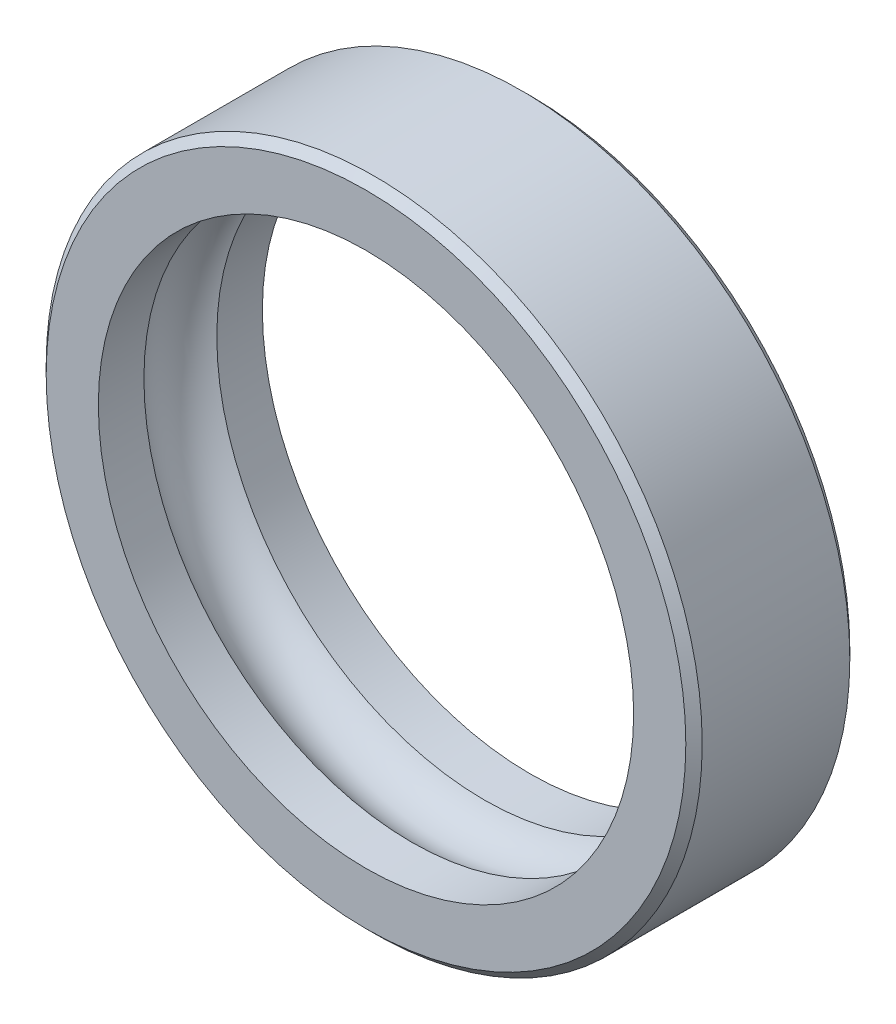
ISO-10303-21;
HEADER;
FILE_DESCRIPTION(('STEP AP214'),'2;1');
FILE_NAME('part.step','',(''),(''),'','','');
FILE_SCHEMA(('AUTOMOTIVE_DESIGN { 1 0 10303 214 1 1 1 1 }'));
ENDSEC;
DATA;
#1=APPLICATION_CONTEXT('core data for automotive mechanical design processes');
#2=APPLICATION_PROTOCOL_DEFINITION('international standard','automotive_design',2000,#1);
#3=PRODUCT_CONTEXT('',#1,'mechanical');
#4=PRODUCT('Part','Part','',(#3));
#5=PRODUCT_RELATED_PRODUCT_CATEGORY('part','',(#4));
#6=PRODUCT_DEFINITION_FORMATION('','',#4);
#7=PRODUCT_DEFINITION_CONTEXT('part definition',#1,'design');
#8=PRODUCT_DEFINITION('design','',#6,#7);
#9=PRODUCT_DEFINITION_SHAPE('','',#8);
#10=(LENGTH_UNIT() NAMED_UNIT(*) SI_UNIT(.MILLI.,.METRE.));
#11=(NAMED_UNIT(*) PLANE_ANGLE_UNIT() SI_UNIT($,.RADIAN.));
#12=(NAMED_UNIT(*) SI_UNIT($,.STERADIAN.) SOLID_ANGLE_UNIT());
#13=UNCERTAINTY_MEASURE_WITH_UNIT(LENGTH_MEASURE(1.E-05),#10,'distance_accuracy_value','');
#14=(GEOMETRIC_REPRESENTATION_CONTEXT(3) GLOBAL_UNCERTAINTY_ASSIGNED_CONTEXT((#13)) GLOBAL_UNIT_ASSIGNED_CONTEXT((#10,
#11,#12)) REPRESENTATION_CONTEXT('',''));
#15=CARTESIAN_POINT('',(0.,0.,0.));
#16=DIRECTION('',(0.,0.,1.));
#17=DIRECTION('',(1.,0.,0.));
#18=AXIS2_PLACEMENT_3D('',#15,#16,#17);
#19=CARTESIAN_POINT('',(0.,0.,0.));
#20=DIRECTION('',(0.,0.,1.));
#21=DIRECTION('',(1.,0.,0.));
#22=AXIS2_PLACEMENT_3D('',#19,#20,#21);
#23=TOROIDAL_SURFACE('',#22,4.7625,0.820428356767388);
#24=CARTESIAN_POINT('',(0.,0.,0.705555555555555));
#25=DIRECTION('',(0.,0.,1.));
#26=DIRECTION('',(1.,0.,0.));
#27=AXIS2_PLACEMENT_3D('',#24,#25,#26);
#28=CIRCLE('',#27,5.18118131868132);
#29=CARTESIAN_POINT('',(5.18118131868132,0.,0.705555555555555));
#30=VERTEX_POINT('',#29);
#31=EDGE_CURVE('E32',#30,#30,#28,.T.);
#32=ORIENTED_EDGE('',*,*,#31,.T.);
#33=EDGE_LOOP('',(#32));
#34=FACE_BOUND('',#33,.T.);
#35=CARTESIAN_POINT('',(0.,0.,-0.705555555555556));
#36=DIRECTION('',(0.,0.,1.));
#37=DIRECTION('',(1.,0.,0.));
#38=AXIS2_PLACEMENT_3D('',#35,#36,#37);
#39=CIRCLE('',#38,5.18118131868132);
#40=CARTESIAN_POINT('',(5.18118131868132,0.,-0.705555555555556));
#41=VERTEX_POINT('',#40);
#42=EDGE_CURVE('E30',#41,#41,#39,.F.);
#43=ORIENTED_EDGE('',*,*,#42,.T.);
#44=EDGE_LOOP('',(#43));
#45=FACE_BOUND('',#44,.T.);
#46=ADVANCED_FACE('F14',(#34,#45),#23,.F.);
#47=CARTESIAN_POINT('',(0.,0.,1.5875));
#48=DIRECTION('',(0.,0.,1.));
#49=DIRECTION('',(1.,0.,0.));
#50=AXIS2_PLACEMENT_3D('',#47,#48,#49);
#51=CYLINDRICAL_SURFACE('',#50,5.18118131868132);
#52=CARTESIAN_POINT('',(0.,0.,1.5875));
#53=DIRECTION('',(0.,0.,1.));
#54=DIRECTION('',(1.,0.,0.));
#55=AXIS2_PLACEMENT_3D('',#52,#53,#54);
#56=CIRCLE('',#55,5.18118131868132);
#57=CARTESIAN_POINT('',(5.18118131868132,0.,1.5875));
#58=VERTEX_POINT('',#57);
#59=EDGE_CURVE('E18',#58,#58,#56,.T.);
#60=ORIENTED_EDGE('',*,*,#59,.T.);
#61=EDGE_LOOP('',(#60));
#62=FACE_BOUND('',#61,.T.);
#63=ORIENTED_EDGE('',*,*,#31,.F.);
#64=EDGE_LOOP('',(#63));
#65=FACE_BOUND('',#64,.T.);
#66=ADVANCED_FACE('F48',(#62,#65),#51,.F.);
#67=CARTESIAN_POINT('',(0.,0.,1.5875));
#68=DIRECTION('',(0.,0.,1.));
#69=DIRECTION('',(1.,0.,0.));
#70=AXIS2_PLACEMENT_3D('',#67,#68,#69);
#71=CYLINDRICAL_SURFACE('',#70,5.18118131868132);
#72=ORIENTED_EDGE('',*,*,#42,.F.);
#73=EDGE_LOOP('',(#72));
#74=FACE_BOUND('',#73,.T.);
#75=CARTESIAN_POINT('',(0.,0.,-1.5875));
#76=DIRECTION('',(0.,0.,1.));
#77=DIRECTION('',(1.,0.,0.));
#78=AXIS2_PLACEMENT_3D('',#75,#76,#77);
#79=CIRCLE('',#78,5.18118131868132);
#80=CARTESIAN_POINT('',(5.18118131868132,0.,-1.5875));
#81=VERTEX_POINT('',#80);
#82=EDGE_CURVE('E41',#81,#81,#79,.F.);
#83=ORIENTED_EDGE('',*,*,#82,.T.);
#84=EDGE_LOOP('',(#83));
#85=FACE_BOUND('',#84,.T.);
#86=ADVANCED_FACE('F55',(#74,#85),#71,.F.);
#87=CARTESIAN_POINT('',(0.,6.19125,1.5875));
#88=DIRECTION('',(0.,0.,-1.));
#89=DIRECTION('',(-1.,0.,0.));
#90=AXIS2_PLACEMENT_3D('',#87,#88,#89);
#91=PLANE('',#90);
#92=ORIENTED_EDGE('',*,*,#59,.F.);
#93=EDGE_LOOP('',(#92));
#94=FACE_BOUND('',#93,.T.);
#95=CARTESIAN_POINT('',(0.,0.,1.5875));
#96=DIRECTION('',(0.,0.,-1.));
#97=DIRECTION('',(-1.,0.,0.));
#98=AXIS2_PLACEMENT_3D('',#95,#96,#97);
#99=CIRCLE('',#98,6.19125);
#100=CARTESIAN_POINT('',(-6.19125,0.,1.5875));
#101=VERTEX_POINT('',#100);
#102=EDGE_CURVE('E39',#101,#101,#99,.T.);
#103=ORIENTED_EDGE('',*,*,#102,.F.);
#104=EDGE_LOOP('',(#103));
#105=FACE_BOUND('',#104,.T.);
#106=ADVANCED_FACE('F51',(#94,#105),#91,.F.);
#107=CARTESIAN_POINT('',(0.,6.19125,-1.5875));
#108=DIRECTION('',(0.,0.,1.));
#109=DIRECTION('',(1.,0.,0.));
#110=AXIS2_PLACEMENT_3D('',#107,#108,#109);
#111=PLANE('',#110);
#112=ORIENTED_EDGE('',*,*,#82,.F.);
#113=EDGE_LOOP('',(#112));
#114=FACE_BOUND('',#113,.T.);
#115=CARTESIAN_POINT('',(0.,0.,-1.5875));
#116=DIRECTION('',(0.,0.,1.));
#117=DIRECTION('',(1.,0.,0.));
#118=AXIS2_PLACEMENT_3D('',#115,#116,#117);
#119=CIRCLE('',#118,6.19125);
#120=CARTESIAN_POINT('',(6.19125,0.,-1.5875));
#121=VERTEX_POINT('',#120);
#122=EDGE_CURVE('E27',#121,#121,#119,.T.);
#123=ORIENTED_EDGE('',*,*,#122,.F.);
#124=EDGE_LOOP('',(#123));
#125=FACE_BOUND('',#124,.T.);
#126=ADVANCED_FACE('F54',(#114,#125),#111,.F.);
#127=CARTESIAN_POINT('',(0.,0.,1.42875));
#128=DIRECTION('',(0.,0.,-1.));
#129=DIRECTION('',(-1.,0.,0.));
#130=AXIS2_PLACEMENT_3D('',#127,#128,#129);
#131=CONICAL_SURFACE('',#130,6.35,0.785398163397448);
#132=CARTESIAN_POINT('',(0.,0.,1.42875));
#133=DIRECTION('',(0.,0.,1.));
#134=DIRECTION('',(1.,0.,0.));
#135=AXIS2_PLACEMENT_3D('',#132,#133,#134);
#136=CIRCLE('',#135,6.35);
#137=CARTESIAN_POINT('',(6.35,0.,1.42875));
#138=VERTEX_POINT('',#137);
#139=EDGE_CURVE('E22',#138,#138,#136,.F.);
#140=ORIENTED_EDGE('',*,*,#139,.F.);
#141=EDGE_LOOP('',(#140));
#142=FACE_BOUND('',#141,.T.);
#143=ORIENTED_EDGE('',*,*,#102,.T.);
#144=EDGE_LOOP('',(#143));
#145=FACE_BOUND('',#144,.T.);
#146=ADVANCED_FACE('F59',(#142,#145),#131,.T.);
#147=CARTESIAN_POINT('',(0.,0.,-1.42875));
#148=DIRECTION('',(0.,0.,1.));
#149=DIRECTION('',(1.,0.,0.));
#150=AXIS2_PLACEMENT_3D('',#147,#148,#149);
#151=CONICAL_SURFACE('',#150,6.35,0.785398163397448);
#152=CARTESIAN_POINT('',(0.,0.,-1.42875));
#153=DIRECTION('',(0.,0.,1.));
#154=DIRECTION('',(1.,0.,0.));
#155=AXIS2_PLACEMENT_3D('',#152,#153,#154);
#156=CIRCLE('',#155,6.35);
#157=CARTESIAN_POINT('',(6.35,0.,-1.42875));
#158=VERTEX_POINT('',#157);
#159=EDGE_CURVE('E10',#158,#158,#156,.T.);
#160=ORIENTED_EDGE('',*,*,#159,.F.);
#161=EDGE_LOOP('',(#160));
#162=FACE_BOUND('',#161,.T.);
#163=ORIENTED_EDGE('',*,*,#122,.T.);
#164=EDGE_LOOP('',(#163));
#165=FACE_BOUND('',#164,.T.);
#166=ADVANCED_FACE('F61',(#162,#165),#151,.T.);
#167=CARTESIAN_POINT('',(0.,0.,1.5875));
#168=DIRECTION('',(0.,0.,1.));
#169=DIRECTION('',(1.,0.,0.));
#170=AXIS2_PLACEMENT_3D('',#167,#168,#169);
#171=CYLINDRICAL_SURFACE('',#170,6.35);
#172=ORIENTED_EDGE('',*,*,#139,.T.);
#173=EDGE_LOOP('',(#172));
#174=FACE_BOUND('',#173,.T.);
#175=ORIENTED_EDGE('',*,*,#159,.T.);
#176=EDGE_LOOP('',(#175));
#177=FACE_BOUND('',#176,.T.);
#178=ADVANCED_FACE('F69',(#174,#177),#171,.T.);
#179=CLOSED_SHELL('',(#46,#66,#86,#106,#126,#146,#166,#178));
#180=MANIFOLD_SOLID_BREP('B1',#179);
#181=ADVANCED_BREP_SHAPE_REPRESENTATION('',(#18,#180),#14);
#182=SHAPE_DEFINITION_REPRESENTATION(#9,#181);
ENDSEC;
END-ISO-10303-21;
